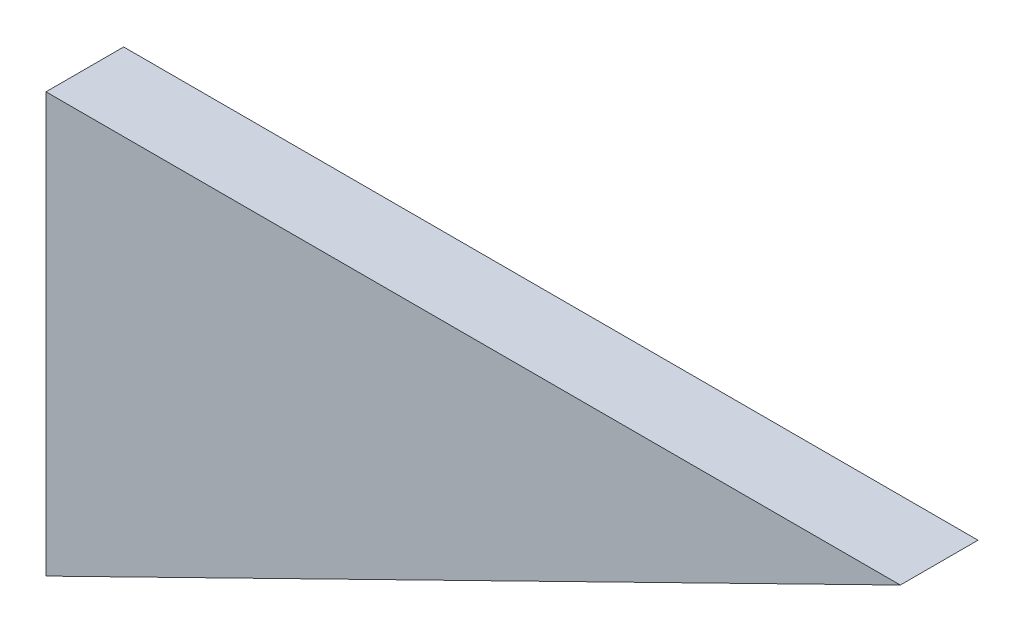
ISO-10303-21;
HEADER;
FILE_DESCRIPTION(('STEP AP214'),'2;1');
FILE_NAME('part.step','',(''),(''),'','','');
FILE_SCHEMA(('AUTOMOTIVE_DESIGN { 1 0 10303 214 1 1 1 1 }'));
ENDSEC;
DATA;
#1=APPLICATION_CONTEXT('core data for automotive mechanical design processes');
#2=APPLICATION_PROTOCOL_DEFINITION('international standard','automotive_design',2000,#1);
#3=PRODUCT_CONTEXT('',#1,'mechanical');
#4=PRODUCT('Part','Part','',(#3));
#5=PRODUCT_RELATED_PRODUCT_CATEGORY('part','',(#4));
#6=PRODUCT_DEFINITION_FORMATION('','',#4);
#7=PRODUCT_DEFINITION_CONTEXT('part definition',#1,'design');
#8=PRODUCT_DEFINITION('design','',#6,#7);
#9=PRODUCT_DEFINITION_SHAPE('','',#8);
#10=(LENGTH_UNIT() NAMED_UNIT(*) SI_UNIT(.MILLI.,.METRE.));
#11=(NAMED_UNIT(*) PLANE_ANGLE_UNIT() SI_UNIT($,.RADIAN.));
#12=(NAMED_UNIT(*) SI_UNIT($,.STERADIAN.) SOLID_ANGLE_UNIT());
#13=UNCERTAINTY_MEASURE_WITH_UNIT(LENGTH_MEASURE(1.E-05),#10,'distance_accuracy_value','');
#14=(GEOMETRIC_REPRESENTATION_CONTEXT(3) GLOBAL_UNCERTAINTY_ASSIGNED_CONTEXT((#13)) GLOBAL_UNIT_ASSIGNED_CONTEXT((#10,
#11,#12)) REPRESENTATION_CONTEXT('',''));
#15=CARTESIAN_POINT('',(0.,0.,0.));
#16=DIRECTION('',(0.,0.,1.));
#17=DIRECTION('',(1.,0.,0.));
#18=AXIS2_PLACEMENT_3D('',#15,#16,#17);
#19=CARTESIAN_POINT('',(0.,-27.,5.));
#20=DIRECTION('',(1.,0.,0.));
#21=DIRECTION('',(0.,0.,-1.));
#22=AXIS2_PLACEMENT_3D('',#19,#20,#21);
#23=PLANE('',#22);
#24=DIRECTION('',(0.,-1.,0.));
#25=VECTOR('',#24,1.);
#26=CARTESIAN_POINT('',(0.,-27.,0.));
#27=LINE('',#26,#25);
#28=CARTESIAN_POINT('',(0.,0.,0.));
#29=VERTEX_POINT('',#28);
#30=CARTESIAN_POINT('',(0.,-27.,0.));
#31=VERTEX_POINT('',#30);
#32=EDGE_CURVE('E86',#29,#31,#27,.T.);
#33=ORIENTED_EDGE('',*,*,#32,.T.);
#34=DIRECTION('',(0.,0.,-1.));
#35=VECTOR('',#34,1.);
#36=CARTESIAN_POINT('',(0.,-27.,5.));
#37=LINE('',#36,#35);
#38=CARTESIAN_POINT('',(0.,-27.,5.));
#39=VERTEX_POINT('',#38);
#40=EDGE_CURVE('E11',#39,#31,#37,.T.);
#41=ORIENTED_EDGE('',*,*,#40,.F.);
#42=DIRECTION('',(0.,-1.,0.));
#43=VECTOR('',#42,1.);
#44=CARTESIAN_POINT('',(0.,-27.,5.));
#45=LINE('',#44,#43);
#46=CARTESIAN_POINT('',(0.,0.,5.));
#47=VERTEX_POINT('',#46);
#48=EDGE_CURVE('E79',#47,#39,#45,.T.);
#49=ORIENTED_EDGE('',*,*,#48,.F.);
#50=DIRECTION('',(0.,0.,-1.));
#51=VECTOR('',#50,1.);
#52=CARTESIAN_POINT('',(0.,0.,5.));
#53=LINE('',#52,#51);
#54=EDGE_CURVE('E87',#47,#29,#53,.T.);
#55=ORIENTED_EDGE('',*,*,#54,.T.);
#56=EDGE_LOOP('',(#33,#41,#49,#55));
#57=FACE_BOUND('',#56,.T.);
#58=ADVANCED_FACE('F39',(#57),#23,.F.);
#59=CARTESIAN_POINT('',(55.,0.,5.));
#60=DIRECTION('',(-0.440673190639415,0.89766761056177,0.));
#61=DIRECTION('',(-0.89766761056177,-0.440673190639415,0.));
#62=AXIS2_PLACEMENT_3D('',#59,#60,#61);
#63=PLANE('',#62);
#64=DIRECTION('',(0.89766761056177,0.440673190639415,0.));
#65=VECTOR('',#64,1.);
#66=CARTESIAN_POINT('',(55.,0.,0.));
#67=LINE('',#66,#65);
#68=CARTESIAN_POINT('',(55.,0.,0.));
#69=VERTEX_POINT('',#68);
#70=EDGE_CURVE('E67',#31,#69,#67,.T.);
#71=ORIENTED_EDGE('',*,*,#70,.T.);
#72=DIRECTION('',(0.,0.,-1.));
#73=VECTOR('',#72,1.);
#74=CARTESIAN_POINT('',(55.,0.,5.));
#75=LINE('',#74,#73);
#76=CARTESIAN_POINT('',(55.,0.,5.));
#77=VERTEX_POINT('',#76);
#78=EDGE_CURVE('E47',#77,#69,#75,.T.);
#79=ORIENTED_EDGE('',*,*,#78,.F.);
#80=DIRECTION('',(0.89766761056177,0.440673190639415,0.));
#81=VECTOR('',#80,1.);
#82=CARTESIAN_POINT('',(55.,0.,5.));
#83=LINE('',#82,#81);
#84=EDGE_CURVE('E75',#39,#77,#83,.T.);
#85=ORIENTED_EDGE('',*,*,#84,.F.);
#86=ORIENTED_EDGE('',*,*,#40,.T.);
#87=EDGE_LOOP('',(#71,#79,#85,#86));
#88=FACE_BOUND('',#87,.T.);
#89=ADVANCED_FACE('F76',(#88),#63,.F.);
#90=CARTESIAN_POINT('',(0.,0.,5.));
#91=DIRECTION('',(0.,-1.,0.));
#92=DIRECTION('',(0.,0.,-1.));
#93=AXIS2_PLACEMENT_3D('',#90,#91,#92);
#94=PLANE('',#93);
#95=DIRECTION('',(-1.,0.,0.));
#96=VECTOR('',#95,1.);
#97=CARTESIAN_POINT('',(0.,0.,0.));
#98=LINE('',#97,#96);
#99=EDGE_CURVE('E72',#69,#29,#98,.T.);
#100=ORIENTED_EDGE('',*,*,#99,.T.);
#101=ORIENTED_EDGE('',*,*,#54,.F.);
#102=DIRECTION('',(-1.,0.,0.));
#103=VECTOR('',#102,1.);
#104=CARTESIAN_POINT('',(0.,0.,5.));
#105=LINE('',#104,#103);
#106=EDGE_CURVE('E55',#77,#47,#105,.T.);
#107=ORIENTED_EDGE('',*,*,#106,.F.);
#108=ORIENTED_EDGE('',*,*,#78,.T.);
#109=EDGE_LOOP('',(#100,#101,#107,#108));
#110=FACE_BOUND('',#109,.T.);
#111=ADVANCED_FACE('F94',(#110),#94,.F.);
#112=CARTESIAN_POINT('',(0.,0.,5.));
#113=DIRECTION('',(0.,0.,-1.));
#114=DIRECTION('',(-1.,0.,0.));
#115=AXIS2_PLACEMENT_3D('',#112,#113,#114);
#116=PLANE('',#115);
#117=ORIENTED_EDGE('',*,*,#48,.T.);
#118=ORIENTED_EDGE('',*,*,#84,.T.);
#119=ORIENTED_EDGE('',*,*,#106,.T.);
#120=EDGE_LOOP('',(#117,#118,#119));
#121=FACE_BOUND('',#120,.T.);
#122=ADVANCED_FACE('F82',(#121),#116,.F.);
#123=CARTESIAN_POINT('',(0.,0.,0.));
#124=DIRECTION('',(0.,0.,-1.));
#125=DIRECTION('',(-1.,0.,0.));
#126=AXIS2_PLACEMENT_3D('',#123,#124,#125);
#127=PLANE('',#126);
#128=ORIENTED_EDGE('',*,*,#32,.F.);
#129=ORIENTED_EDGE('',*,*,#99,.F.);
#130=ORIENTED_EDGE('',*,*,#70,.F.);
#131=EDGE_LOOP('',(#128,#129,#130));
#132=FACE_BOUND('',#131,.T.);
#133=ADVANCED_FACE('F95',(#132),#127,.T.);
#134=CLOSED_SHELL('',(#58,#89,#111,#122,#133));
#135=MANIFOLD_SOLID_BREP('B2',#134);
#136=ADVANCED_BREP_SHAPE_REPRESENTATION('',(#18,#135),#14);
#137=SHAPE_DEFINITION_REPRESENTATION(#9,#136);
ENDSEC;
END-ISO-10303-21;
